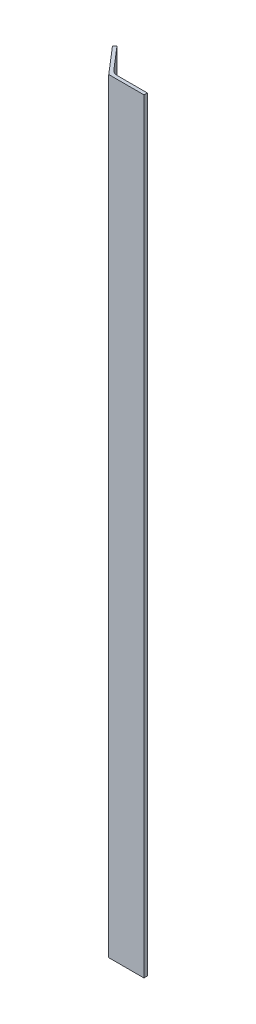
ISO-10303-21;
HEADER;
FILE_DESCRIPTION(('STEP AP214'),'2;1');
FILE_NAME('part.step','',(''),(''),'','','');
FILE_SCHEMA(('AUTOMOTIVE_DESIGN { 1 0 10303 214 1 1 1 1 }'));
ENDSEC;
DATA;
#1=APPLICATION_CONTEXT('core data for automotive mechanical design processes');
#2=APPLICATION_PROTOCOL_DEFINITION('international standard','automotive_design',2000,#1);
#3=PRODUCT_CONTEXT('',#1,'mechanical');
#4=PRODUCT('Part','Part','',(#3));
#5=PRODUCT_RELATED_PRODUCT_CATEGORY('part','',(#4));
#6=PRODUCT_DEFINITION_FORMATION('','',#4);
#7=PRODUCT_DEFINITION_CONTEXT('part definition',#1,'design');
#8=PRODUCT_DEFINITION('design','',#6,#7);
#9=PRODUCT_DEFINITION_SHAPE('','',#8);
#10=(LENGTH_UNIT() NAMED_UNIT(*) SI_UNIT(.MILLI.,.METRE.));
#11=(NAMED_UNIT(*) PLANE_ANGLE_UNIT() SI_UNIT($,.RADIAN.));
#12=(NAMED_UNIT(*) SI_UNIT($,.STERADIAN.) SOLID_ANGLE_UNIT());
#13=UNCERTAINTY_MEASURE_WITH_UNIT(LENGTH_MEASURE(1.E-05),#10,'distance_accuracy_value','');
#14=(GEOMETRIC_REPRESENTATION_CONTEXT(3) GLOBAL_UNCERTAINTY_ASSIGNED_CONTEXT((#13)) GLOBAL_UNIT_ASSIGNED_CONTEXT((#10,
#11,#12)) REPRESENTATION_CONTEXT('',''));
#15=CARTESIAN_POINT('',(0.,0.,0.));
#16=DIRECTION('',(0.,0.,1.));
#17=DIRECTION('',(1.,0.,0.));
#18=AXIS2_PLACEMENT_3D('',#15,#16,#17);
#19=CARTESIAN_POINT('',(-0.931762463434703,500.,-5.48688166985293));
#20=DIRECTION('',(0.,-1.,0.));
#21=DIRECTION('',(0.,0.,-1.));
#22=AXIS2_PLACEMENT_3D('',#19,#20,#21);
#23=CYLINDRICAL_SURFACE('',#22,5.);
#24=CARTESIAN_POINT('',(-0.931762463434703,40.,-5.48688166985293));
#25=DIRECTION('',(0.,-1.,0.));
#26=DIRECTION('',(0.,0.,-1.));
#27=AXIS2_PLACEMENT_3D('',#24,#25,#26);
#28=CIRCLE('',#27,5.);
#29=CARTESIAN_POINT('',(-0.931762463434703,40.,-0.486881669852926));
#30=VERTEX_POINT('',#29);
#31=CARTESIAN_POINT('',(-4.7228806166599,40.,-2.22690879446172));
#32=VERTEX_POINT('',#31);
#33=EDGE_CURVE('E121',#30,#32,#28,.T.);
#34=ORIENTED_EDGE('',*,*,#33,.T.);
#35=DIRECTION('',(0.,-1.,0.));
#36=VECTOR('',#35,1.);
#37=CARTESIAN_POINT('',(-4.7228806166599,500.,-2.22690879446172));
#38=LINE('',#37,#36);
#39=CARTESIAN_POINT('',(-4.7228806166599,500.,-2.22690879446172));
#40=VERTEX_POINT('',#39);
#41=EDGE_CURVE('E11',#40,#32,#38,.T.);
#42=ORIENTED_EDGE('',*,*,#41,.F.);
#43=CARTESIAN_POINT('',(-0.931762463434703,500.,-5.48688166985293));
#44=DIRECTION('',(0.,-1.,0.));
#45=DIRECTION('',(0.,0.,-1.));
#46=AXIS2_PLACEMENT_3D('',#43,#44,#45);
#47=CIRCLE('',#46,5.);
#48=CARTESIAN_POINT('',(-0.931762463434703,500.,-0.486881669852926));
#49=VERTEX_POINT('',#48);
#50=EDGE_CURVE('E133',#49,#40,#47,.T.);
#51=ORIENTED_EDGE('',*,*,#50,.F.);
#52=DIRECTION('',(0.,-1.,0.));
#53=VECTOR('',#52,1.);
#54=CARTESIAN_POINT('',(-0.931762463434703,500.,-0.486881669852926));
#55=LINE('',#54,#53);
#56=EDGE_CURVE('E117',#49,#30,#55,.T.);
#57=ORIENTED_EDGE('',*,*,#56,.T.);
#58=EDGE_LOOP('',(#34,#42,#51,#57));
#59=FACE_BOUND('',#58,.T.);
#60=ADVANCED_FACE('F31',(#59),#23,.F.);
#61=CARTESIAN_POINT('',(-16.3083976555303,500.,-15.7000466515645));
#62=DIRECTION('',(-0.758223630645039,0.,0.651994575078241));
#63=DIRECTION('',(0.651994575078241,0.,0.758223630645039));
#64=AXIS2_PLACEMENT_3D('',#61,#62,#63);
#65=PLANE('',#64);
#66=DIRECTION('',(-0.651994575078241,0.,-0.758223630645039));
#67=VECTOR('',#66,1.);
#68=CARTESIAN_POINT('',(-16.3083976555303,40.,-15.7000466515645));
#69=LINE('',#68,#67);
#70=CARTESIAN_POINT('',(-16.3083976555303,40.,-15.7000466515645));
#71=VERTEX_POINT('',#70);
#72=EDGE_CURVE('E124',#32,#71,#69,.T.);
#73=ORIENTED_EDGE('',*,*,#72,.T.);
#74=DIRECTION('',(0.,-1.,0.));
#75=VECTOR('',#74,1.);
#76=CARTESIAN_POINT('',(-16.3083976555303,500.,-15.7000466515645));
#77=LINE('',#76,#75);
#78=CARTESIAN_POINT('',(-16.3083976555303,500.,-15.7000466515645));
#79=VERTEX_POINT('',#78);
#80=EDGE_CURVE('E39',#79,#71,#77,.T.);
#81=ORIENTED_EDGE('',*,*,#80,.F.);
#82=DIRECTION('',(-0.651994575078241,0.,-0.758223630645039));
#83=VECTOR('',#82,1.);
#84=CARTESIAN_POINT('',(-16.3083976555303,500.,-15.7000466515645));
#85=LINE('',#84,#83);
#86=EDGE_CURVE('E87',#40,#79,#85,.T.);
#87=ORIENTED_EDGE('',*,*,#86,.F.);
#88=ORIENTED_EDGE('',*,*,#41,.T.);
#89=EDGE_LOOP('',(#73,#81,#87,#88));
#90=FACE_BOUND('',#89,.T.);
#91=ADVANCED_FACE('F158',(#90),#65,.F.);
#92=CARTESIAN_POINT('',(-17.7667098470109,500.,-14.4460477003489));
#93=DIRECTION('',(0.651994575078241,0.,0.758223630645039));
#94=DIRECTION('',(0.758223630645039,0.,-0.651994575078241));
#95=AXIS2_PLACEMENT_3D('',#92,#93,#94);
#96=PLANE('',#95);
#97=DIRECTION('',(-0.758223630645039,0.,0.651994575078241));
#98=VECTOR('',#97,1.);
#99=CARTESIAN_POINT('',(-17.7667098470109,40.,-14.4460477003489));
#100=LINE('',#99,#98);
#101=CARTESIAN_POINT('',(-17.7667098470109,40.,-14.4460477003489));
#102=VERTEX_POINT('',#101);
#103=EDGE_CURVE('E126',#71,#102,#100,.T.);
#104=ORIENTED_EDGE('',*,*,#103,.T.);
#105=DIRECTION('',(0.,-1.,0.));
#106=VECTOR('',#105,1.);
#107=CARTESIAN_POINT('',(-17.7667098470109,500.,-14.4460477003489));
#108=LINE('',#107,#106);
#109=CARTESIAN_POINT('',(-17.7667098470109,500.,-14.4460477003489));
#110=VERTEX_POINT('',#109);
#111=EDGE_CURVE('E137',#110,#102,#108,.T.);
#112=ORIENTED_EDGE('',*,*,#111,.F.);
#113=DIRECTION('',(-0.758223630645039,0.,0.651994575078241));
#114=VECTOR('',#113,1.);
#115=CARTESIAN_POINT('',(-17.7667098470109,500.,-14.4460477003489));
#116=LINE('',#115,#114);
#117=EDGE_CURVE('E145',#79,#110,#116,.T.);
#118=ORIENTED_EDGE('',*,*,#117,.F.);
#119=ORIENTED_EDGE('',*,*,#80,.T.);
#120=EDGE_LOOP('',(#104,#112,#118,#119));
#121=FACE_BOUND('',#120,.T.);
#122=ADVANCED_FACE('F143',(#121),#96,.F.);
#123=CARTESIAN_POINT('',(-17.7667098470109,500.,-14.4460477003489));
#124=DIRECTION('',(0.758223630645039,0.,-0.651994575078241));
#125=DIRECTION('',(-0.651994575078241,0.,-0.758223630645039));
#126=AXIS2_PLACEMENT_3D('',#123,#124,#125);
#127=PLANE('',#126);
#128=DIRECTION('',(0.651994575078241,0.,0.758223630645039));
#129=VECTOR('',#128,1.);
#130=CARTESIAN_POINT('',(-17.7667098470109,40.,-14.4460477003489));
#131=LINE('',#130,#129);
#132=CARTESIAN_POINT('',(-4.04346349315579,40.,1.51311833014707));
#133=VERTEX_POINT('',#132);
#134=EDGE_CURVE('E128',#102,#133,#131,.T.);
#135=ORIENTED_EDGE('',*,*,#134,.T.);
#136=DIRECTION('',(0.,-1.,0.));
#137=VECTOR('',#136,1.);
#138=CARTESIAN_POINT('',(-4.04346349315579,500.,1.51311833014707));
#139=LINE('',#138,#137);
#140=CARTESIAN_POINT('',(-4.04346349315579,500.,1.51311833014707));
#141=VERTEX_POINT('',#140);
#142=EDGE_CURVE('E112',#141,#133,#139,.T.);
#143=ORIENTED_EDGE('',*,*,#142,.F.);
#144=DIRECTION('',(0.651994575078241,0.,0.758223630645039));
#145=VECTOR('',#144,1.);
#146=CARTESIAN_POINT('',(-17.7667098470109,500.,-14.4460477003489));
#147=LINE('',#146,#145);
#148=EDGE_CURVE('E103',#110,#141,#147,.T.);
#149=ORIENTED_EDGE('',*,*,#148,.F.);
#150=ORIENTED_EDGE('',*,*,#111,.T.);
#151=EDGE_LOOP('',(#135,#143,#149,#150));
#152=FACE_BOUND('',#151,.T.);
#153=ADVANCED_FACE('F151',(#152),#127,.F.);
#154=CARTESIAN_POINT('',(-4.04346349315579,500.,1.51311833014707));
#155=DIRECTION('',(0.,0.,-1.));
#156=DIRECTION('',(-1.,0.,0.));
#157=AXIS2_PLACEMENT_3D('',#154,#155,#156);
#158=PLANE('',#157);
#159=DIRECTION('',(1.,0.,0.));
#160=VECTOR('',#159,1.);
#161=CARTESIAN_POINT('',(-4.04346349315579,40.,1.51311833014707));
#162=LINE('',#161,#160);
#163=CARTESIAN_POINT('',(17.1228290420735,40.,1.51311833014707));
#164=VERTEX_POINT('',#163);
#165=EDGE_CURVE('E111',#133,#164,#162,.T.);
#166=ORIENTED_EDGE('',*,*,#165,.T.);
#167=DIRECTION('',(0.,-1.,0.));
#168=VECTOR('',#167,1.);
#169=CARTESIAN_POINT('',(17.1228290420735,500.,1.51311833014707));
#170=LINE('',#169,#168);
#171=CARTESIAN_POINT('',(17.1228290420735,500.,1.51311833014707));
#172=VERTEX_POINT('',#171);
#173=EDGE_CURVE('E108',#172,#164,#170,.T.);
#174=ORIENTED_EDGE('',*,*,#173,.F.);
#175=DIRECTION('',(1.,0.,0.));
#176=VECTOR('',#175,1.);
#177=CARTESIAN_POINT('',(-4.04346349315579,500.,1.51311833014707));
#178=LINE('',#177,#176);
#179=EDGE_CURVE('E97',#141,#172,#178,.T.);
#180=ORIENTED_EDGE('',*,*,#179,.F.);
#181=ORIENTED_EDGE('',*,*,#142,.T.);
#182=EDGE_LOOP('',(#166,#174,#180,#181));
#183=FACE_BOUND('',#182,.T.);
#184=ADVANCED_FACE('F109',(#183),#158,.F.);
#185=CARTESIAN_POINT('',(17.1228290420735,500.,1.51311833014707));
#186=DIRECTION('',(-1.,0.,0.));
#187=DIRECTION('',(0.,0.,1.));
#188=AXIS2_PLACEMENT_3D('',#185,#186,#187);
#189=PLANE('',#188);
#190=DIRECTION('',(0.,0.,-1.));
#191=VECTOR('',#190,1.);
#192=CARTESIAN_POINT('',(17.1228290420735,40.,1.51311833014707));
#193=LINE('',#192,#191);
#194=CARTESIAN_POINT('',(17.1228290420735,40.,-0.486881669852926));
#195=VERTEX_POINT('',#194);
#196=EDGE_CURVE('E73',#164,#195,#193,.T.);
#197=ORIENTED_EDGE('',*,*,#196,.T.);
#198=DIRECTION('',(0.,-1.,0.));
#199=VECTOR('',#198,1.);
#200=CARTESIAN_POINT('',(17.1228290420735,500.,-0.486881669852926));
#201=LINE('',#200,#199);
#202=CARTESIAN_POINT('',(17.1228290420735,500.,-0.486881669852926));
#203=VERTEX_POINT('',#202);
#204=EDGE_CURVE('E113',#203,#195,#201,.T.);
#205=ORIENTED_EDGE('',*,*,#204,.F.);
#206=DIRECTION('',(0.,0.,-1.));
#207=VECTOR('',#206,1.);
#208=CARTESIAN_POINT('',(17.1228290420735,500.,1.51311833014707));
#209=LINE('',#208,#207);
#210=EDGE_CURVE('E101',#172,#203,#209,.T.);
#211=ORIENTED_EDGE('',*,*,#210,.F.);
#212=ORIENTED_EDGE('',*,*,#173,.T.);
#213=EDGE_LOOP('',(#197,#205,#211,#212));
#214=FACE_BOUND('',#213,.T.);
#215=ADVANCED_FACE('F115',(#214),#189,.F.);
#216=CARTESIAN_POINT('',(-0.931762463434703,500.,-0.486881669852926));
#217=DIRECTION('',(0.,0.,1.));
#218=DIRECTION('',(1.,0.,0.));
#219=AXIS2_PLACEMENT_3D('',#216,#217,#218);
#220=PLANE('',#219);
#221=DIRECTION('',(-1.,0.,0.));
#222=VECTOR('',#221,1.);
#223=CARTESIAN_POINT('',(-0.931762463434703,40.,-0.486881669852926));
#224=LINE('',#223,#222);
#225=EDGE_CURVE('E79',#195,#30,#224,.T.);
#226=ORIENTED_EDGE('',*,*,#225,.T.);
#227=ORIENTED_EDGE('',*,*,#56,.F.);
#228=DIRECTION('',(-1.,0.,0.));
#229=VECTOR('',#228,1.);
#230=CARTESIAN_POINT('',(-0.931762463434703,500.,-0.486881669852926));
#231=LINE('',#230,#229);
#232=EDGE_CURVE('E47',#203,#49,#231,.T.);
#233=ORIENTED_EDGE('',*,*,#232,.F.);
#234=ORIENTED_EDGE('',*,*,#204,.T.);
#235=EDGE_LOOP('',(#226,#227,#233,#234));
#236=FACE_BOUND('',#235,.T.);
#237=ADVANCED_FACE('F172',(#236),#220,.F.);
#238=CARTESIAN_POINT('',(-0.931762463434703,500.,-5.48688166985293));
#239=DIRECTION('',(0.,-1.,0.));
#240=DIRECTION('',(0.,0.,-1.));
#241=AXIS2_PLACEMENT_3D('',#238,#239,#240);
#242=PLANE('',#241);
#243=ORIENTED_EDGE('',*,*,#50,.T.);
#244=ORIENTED_EDGE('',*,*,#86,.T.);
#245=ORIENTED_EDGE('',*,*,#117,.T.);
#246=ORIENTED_EDGE('',*,*,#148,.T.);
#247=ORIENTED_EDGE('',*,*,#179,.T.);
#248=ORIENTED_EDGE('',*,*,#210,.T.);
#249=ORIENTED_EDGE('',*,*,#232,.T.);
#250=EDGE_LOOP('',(#243,#244,#245,#246,#247,#248,#249));
#251=FACE_BOUND('',#250,.T.);
#252=ADVANCED_FACE('F99',(#251),#242,.F.);
#253=CARTESIAN_POINT('',(-0.931762463434703,40.,-5.48688166985293));
#254=DIRECTION('',(0.,-1.,0.));
#255=DIRECTION('',(0.,0.,-1.));
#256=AXIS2_PLACEMENT_3D('',#253,#254,#255);
#257=PLANE('',#256);
#258=ORIENTED_EDGE('',*,*,#33,.F.);
#259=ORIENTED_EDGE('',*,*,#225,.F.);
#260=ORIENTED_EDGE('',*,*,#196,.F.);
#261=ORIENTED_EDGE('',*,*,#165,.F.);
#262=ORIENTED_EDGE('',*,*,#134,.F.);
#263=ORIENTED_EDGE('',*,*,#103,.F.);
#264=ORIENTED_EDGE('',*,*,#72,.F.);
#265=EDGE_LOOP('',(#258,#259,#260,#261,#262,#263,#264));
#266=FACE_BOUND('',#265,.T.);
#267=ADVANCED_FACE('F149',(#266),#257,.T.);
#268=CLOSED_SHELL('',(#60,#91,#122,#153,#184,#215,#237,#252,#267));
#269=MANIFOLD_SOLID_BREP('B2',#268);
#270=ADVANCED_BREP_SHAPE_REPRESENTATION('',(#18,#269),#14);
#271=SHAPE_DEFINITION_REPRESENTATION(#9,#270);
ENDSEC;
END-ISO-10303-21;
